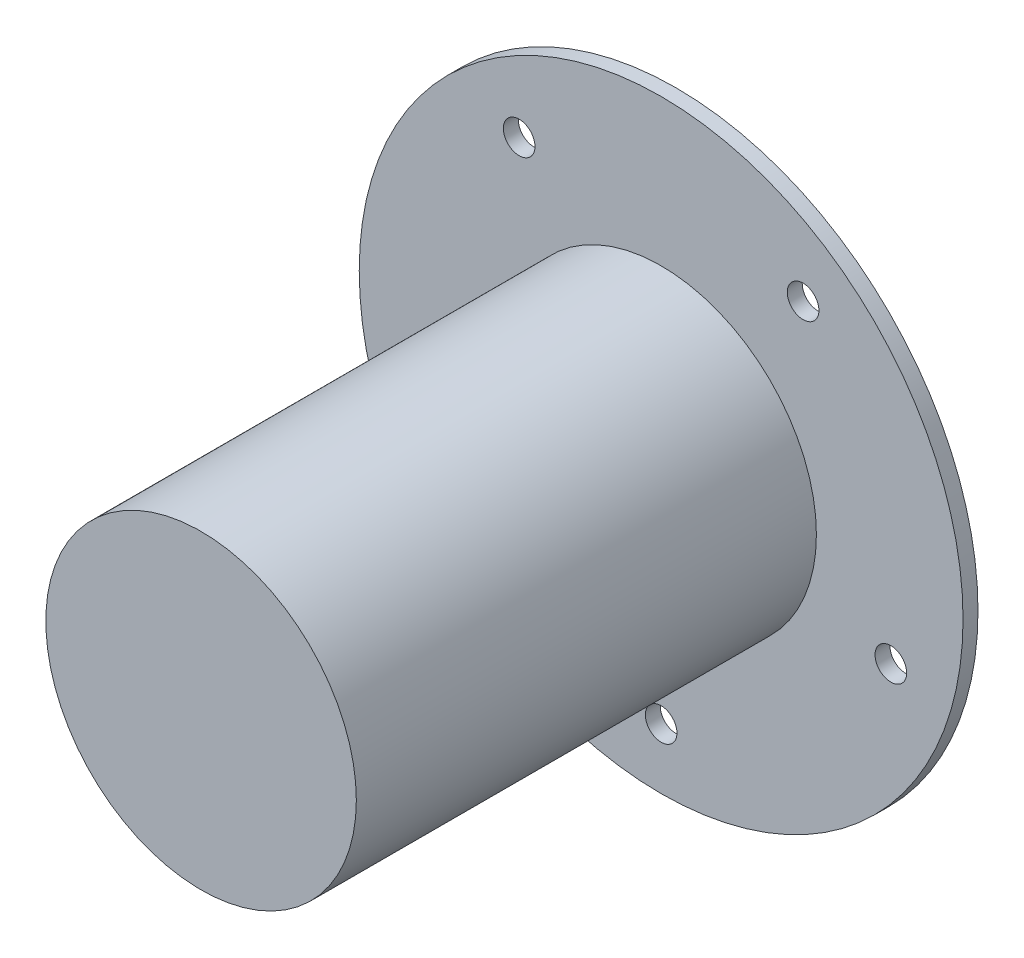
ISO-10303-21;
HEADER;
FILE_DESCRIPTION(('STEP AP214'),'2;1');
FILE_NAME('part.step','',(''),(''),'','','');
FILE_SCHEMA(('AUTOMOTIVE_DESIGN { 1 0 10303 214 1 1 1 1 }'));
ENDSEC;
DATA;
#1=APPLICATION_CONTEXT('core data for automotive mechanical design processes');
#2=APPLICATION_PROTOCOL_DEFINITION('international standard','automotive_design',2000,#1);
#3=PRODUCT_CONTEXT('',#1,'mechanical');
#4=PRODUCT('Part','Part','',(#3));
#5=PRODUCT_RELATED_PRODUCT_CATEGORY('part','',(#4));
#6=PRODUCT_DEFINITION_FORMATION('','',#4);
#7=PRODUCT_DEFINITION_CONTEXT('part definition',#1,'design');
#8=PRODUCT_DEFINITION('design','',#6,#7);
#9=PRODUCT_DEFINITION_SHAPE('','',#8);
#10=(LENGTH_UNIT() NAMED_UNIT(*) SI_UNIT(.MILLI.,.METRE.));
#11=(NAMED_UNIT(*) PLANE_ANGLE_UNIT() SI_UNIT($,.RADIAN.));
#12=(NAMED_UNIT(*) SI_UNIT($,.STERADIAN.) SOLID_ANGLE_UNIT());
#13=UNCERTAINTY_MEASURE_WITH_UNIT(LENGTH_MEASURE(1.E-05),#10,'distance_accuracy_value','');
#14=(GEOMETRIC_REPRESENTATION_CONTEXT(3) GLOBAL_UNCERTAINTY_ASSIGNED_CONTEXT((#13)) GLOBAL_UNIT_ASSIGNED_CONTEXT((#10,
#11,#12)) REPRESENTATION_CONTEXT('',''));
#15=CARTESIAN_POINT('',(0.,0.,0.));
#16=DIRECTION('',(0.,0.,1.));
#17=DIRECTION('',(1.,0.,0.));
#18=AXIS2_PLACEMENT_3D('',#15,#16,#17);
#19=CARTESIAN_POINT('',(0.,0.,-2.59999999999999));
#20=DIRECTION('',(0.,0.,1.));
#21=DIRECTION('',(1.,0.,0.));
#22=AXIS2_PLACEMENT_3D('',#19,#20,#21);
#23=CYLINDRICAL_SURFACE('',#22,52.5);
#24=CARTESIAN_POINT('',(0.,0.,-2.59999999999999));
#25=DIRECTION('',(0.,0.,1.));
#26=DIRECTION('',(-1.,0.,0.));
#27=AXIS2_PLACEMENT_3D('',#24,#25,#26);
#28=CIRCLE('',#27,52.5);
#29=CARTESIAN_POINT('',(52.5,0.,-2.59999999999999));
#30=VERTEX_POINT('',#29);
#31=EDGE_CURVE('E37',#30,#30,#28,.T.);
#32=CARTESIAN_POINT('',(0.,0.,0.));
#33=DIRECTION('',(0.,0.,1.));
#34=DIRECTION('',(-1.,0.,0.));
#35=AXIS2_PLACEMENT_3D('',#32,#33,#34);
#36=CIRCLE('',#35,52.5);
#37=CARTESIAN_POINT('',(52.5,0.,0.));
#38=VERTEX_POINT('',#37);
#39=EDGE_CURVE('E33',#38,#38,#36,.T.);
#40=CARTESIAN_POINT('',(52.5,0.,-2.59999999999999));
#41=CARTESIAN_POINT('',(52.5,0.,-2.57291666666666));
#42=CARTESIAN_POINT('',(52.5,0.,-2.54583333333332));
#43=CARTESIAN_POINT('',(52.5,0.,-2.49166666666666));
#44=CARTESIAN_POINT('',(52.5,0.,-2.46458333333333));
#45=CARTESIAN_POINT('',(52.5,0.,-2.41041666666666));
#46=CARTESIAN_POINT('',(52.5,0.,-2.38333333333333));
#47=CARTESIAN_POINT('',(52.5,0.,-2.32916666666666));
#48=CARTESIAN_POINT('',(52.5,0.,-2.30208333333333));
#49=CARTESIAN_POINT('',(52.5,0.,-2.24791666666666));
#50=CARTESIAN_POINT('',(52.5,0.,-2.22083333333333));
#51=CARTESIAN_POINT('',(52.5,0.,-2.16666666666666));
#52=CARTESIAN_POINT('',(52.5,0.,-2.13958333333333));
#53=CARTESIAN_POINT('',(52.5,0.,-2.08541666666666));
#54=CARTESIAN_POINT('',(52.5,0.,-2.05833333333333));
#55=CARTESIAN_POINT('',(52.5,0.,-2.00416666666666));
#56=CARTESIAN_POINT('',(52.5,0.,-1.97708333333333));
#57=CARTESIAN_POINT('',(52.5,0.,-1.92291666666666));
#58=CARTESIAN_POINT('',(52.5,0.,-1.89583333333333));
#59=CARTESIAN_POINT('',(52.5,0.,-1.84166666666666));
#60=CARTESIAN_POINT('',(52.5,0.,-1.81458333333333));
#61=CARTESIAN_POINT('',(52.5,0.,-1.76041666666666));
#62=CARTESIAN_POINT('',(52.5,0.,-1.73333333333333));
#63=CARTESIAN_POINT('',(52.5,0.,-1.67916666666666));
#64=CARTESIAN_POINT('',(52.5,0.,-1.65208333333333));
#65=CARTESIAN_POINT('',(52.5,0.,-1.59791666666666));
#66=CARTESIAN_POINT('',(52.5,0.,-1.57083333333333));
#67=CARTESIAN_POINT('',(52.5,0.,-1.51666666666666));
#68=CARTESIAN_POINT('',(52.5,0.,-1.48958333333333));
#69=CARTESIAN_POINT('',(52.5,0.,-1.43541666666666));
#70=CARTESIAN_POINT('',(52.5,0.,-1.40833333333333));
#71=CARTESIAN_POINT('',(52.5,0.,-1.35416666666666));
#72=CARTESIAN_POINT('',(52.5,0.,-1.32708333333333));
#73=CARTESIAN_POINT('',(52.5,0.,-1.27291666666666));
#74=CARTESIAN_POINT('',(52.5,0.,-1.24583333333333));
#75=CARTESIAN_POINT('',(52.5,0.,-1.19166666666666));
#76=CARTESIAN_POINT('',(52.5,0.,-1.16458333333333));
#77=CARTESIAN_POINT('',(52.5,0.,-1.11041666666666));
#78=CARTESIAN_POINT('',(52.5,0.,-1.08333333333333));
#79=CARTESIAN_POINT('',(52.5,0.,-1.02916666666666));
#80=CARTESIAN_POINT('',(52.5,0.,-1.00208333333333));
#81=CARTESIAN_POINT('',(52.5,0.,-0.947916666666664));
#82=CARTESIAN_POINT('',(52.5,0.,-0.920833333333331));
#83=CARTESIAN_POINT('',(52.5,0.,-0.866666666666664));
#84=CARTESIAN_POINT('',(52.5,0.,-0.839583333333331));
#85=CARTESIAN_POINT('',(52.5,0.,-0.785416666666664));
#86=CARTESIAN_POINT('',(52.5,0.,-0.758333333333331));
#87=CARTESIAN_POINT('',(52.5,0.,-0.704166666666664));
#88=CARTESIAN_POINT('',(52.5,0.,-0.677083333333331));
#89=CARTESIAN_POINT('',(52.5,0.,-0.622916666666665));
#90=CARTESIAN_POINT('',(52.5,0.,-0.595833333333332));
#91=CARTESIAN_POINT('',(52.5,0.,-0.541666666666665));
#92=CARTESIAN_POINT('',(52.5,0.,-0.514583333333332));
#93=CARTESIAN_POINT('',(52.5,0.,-0.460416666666666));
#94=CARTESIAN_POINT('',(52.5,0.,-0.433333333333332));
#95=CARTESIAN_POINT('',(52.5,0.,-0.379166666666666));
#96=CARTESIAN_POINT('',(52.5,0.,-0.352083333333333));
#97=CARTESIAN_POINT('',(52.5,0.,-0.297916666666666));
#98=CARTESIAN_POINT('',(52.5,0.,-0.270833333333333));
#99=CARTESIAN_POINT('',(52.5,0.,-0.216666666666666));
#100=CARTESIAN_POINT('',(52.5,0.,-0.189583333333333));
#101=CARTESIAN_POINT('',(52.5,0.,-0.135416666666667));
#102=CARTESIAN_POINT('',(52.5,0.,-0.108333333333333));
#103=CARTESIAN_POINT('',(52.5,0.,-0.0541666666666669));
#104=CARTESIAN_POINT('',(52.5,0.,-0.0270833333333337));
#105=CARTESIAN_POINT('',(52.5,0.,0.));
#106=B_SPLINE_CURVE_WITH_KNOTS('',3,(#40,#41,#42,#43,#44,#45,#46,#47,#48,#49,#50,#51,#52,#53,
#54,#55,#56,#57,#58,#59,#60,#61,#62,#63,#64,#65,#66,#67,#68,#69,#70,#71,#72,#73,#74,#75,#76,#77,
#78,#79,#80,#81,#82,#83,#84,#85,#86,#87,#88,#89,#90,#91,#92,#93,#94,#95,#96,#97,#98,#99,#100,
#101,#102,#103,#104,#105),.UNSPECIFIED.,.F.,.F.,(4,2,2,2,2,2,2,2,2,2,2,2,2,2,2,2,2,2,2,2,2,2,2,
2,2,2,2,2,2,2,2,2,4),(0.,0.0812500000000002,0.1625,0.24375,0.324999999999999,0.406249999999999,
0.487499999999999,0.568749999999999,0.649999999999998,0.731249999999998,0.812499999999997,
0.893749999999997,0.974999999999997,1.05625,1.1375,1.21875,1.3,1.38125,1.4625,1.54375,
1.62499999999999,1.70624999999999,1.78749999999999,1.86874999999999,1.94999999999999,
2.03124999999999,2.11249999999999,2.19374999999999,2.27499999999999,2.35624999999999,
2.43749999999999,2.51874999999999,2.59999999999999),.UNSPECIFIED.);
#107=EDGE_CURVE('BSEAM30',#30,#38,#106,.T.);
#108=ORIENTED_EDGE('',*,*,#31,.T.);
#109=ORIENTED_EDGE('',*,*,#39,.F.);
#110=ORIENTED_EDGE('',*,*,#107,.T.);
#111=ORIENTED_EDGE('',*,*,#107,.F.);
#112=EDGE_LOOP('',(#108,#110,#109,#111));
#113=FACE_BOUND('',#112,.T.);
#114=ADVANCED_FACE('F30',(#113),#23,.T.);
#115=CARTESIAN_POINT('',(0.,0.,-2.59999999999999));
#116=DIRECTION('',(0.,0.,-1.));
#117=DIRECTION('',(-1.,0.,0.));
#118=AXIS2_PLACEMENT_3D('',#115,#116,#117);
#119=PLANE('',#118);
#120=CARTESIAN_POINT('',(-24.6869805962838,33.9787137637479,-2.59999999999999));
#121=DIRECTION('',(0.,0.,1.));
#122=DIRECTION('',(-0.309016994374945,0.951056516295155,0.));
#123=AXIS2_PLACEMENT_3D('',#120,#121,#122);
#124=CIRCLE('',#123,2.75);
#125=CARTESIAN_POINT('',(-23.8371838617527,31.3633083439362,-2.59999999999999));
#126=VERTEX_POINT('',#125);
#127=EDGE_CURVE('E69',#126,#126,#124,.T.);
#128=ORIENTED_EDGE('',*,*,#127,.T.);
#129=EDGE_LOOP('',(#128));
#130=FACE_BOUND('',#129,.T.);
#131=CARTESIAN_POINT('',(24.6869805962841,33.9787137637477,-2.59999999999999));
#132=DIRECTION('',(0.,0.,1.));
#133=DIRECTION('',(0.809016994374951,0.587785252292469,0.));
#134=AXIS2_PLACEMENT_3D('',#131,#132,#133);
#135=CIRCLE('',#134,2.75);
#136=CARTESIAN_POINT('',(22.4621838617529,32.3623043199434,-2.59999999999999));
#137=VERTEX_POINT('',#136);
#138=EDGE_CURVE('E63',#137,#137,#135,.T.);
#139=ORIENTED_EDGE('',*,*,#138,.T.);
#140=EDGE_LOOP('',(#139));
#141=FACE_BOUND('',#140,.T.);
#142=CARTESIAN_POINT('',(39.9443736843963,-12.9787137637481,-2.59999999999999));
#143=DIRECTION('',(0.,0.,1.));
#144=DIRECTION('',(0.809016994374942,-0.58778525229248,0.));
#145=AXIS2_PLACEMENT_3D('',#142,#143,#144);
#146=CIRCLE('',#145,2.75);
#147=CARTESIAN_POINT('',(37.7195769498652,-11.3623043199438,-2.59999999999999));
#148=VERTEX_POINT('',#147);
#149=EDGE_CURVE('E56',#148,#148,#146,.T.);
#150=ORIENTED_EDGE('',*,*,#149,.T.);
#151=EDGE_LOOP('',(#150));
#152=FACE_BOUND('',#151,.T.);
#153=CARTESIAN_POINT('',(-4.66640615037761E-13,-42.,-2.59999999999999));
#154=DIRECTION('',(0.,0.,1.));
#155=DIRECTION('',(-0.309016994374958,-0.95105651629515,0.));
#156=AXIS2_PLACEMENT_3D('',#153,#154,#155);
#157=CIRCLE('',#156,2.75);
#158=CARTESIAN_POINT('',(0.849796734530669,-39.3845945801883,-2.59999999999999));
#159=VERTEX_POINT('',#158);
#160=EDGE_CURVE('E57',#159,#159,#157,.T.);
#161=ORIENTED_EDGE('',*,*,#160,.T.);
#162=EDGE_LOOP('',(#161));
#163=FACE_BOUND('',#162,.T.);
#164=CARTESIAN_POINT('',(-39.9443736843964,-12.9787137637478,-2.59999999999999));
#165=DIRECTION('',(0.,0.,1.));
#166=DIRECTION('',(-1.,0.,0.));
#167=AXIS2_PLACEMENT_3D('',#164,#165,#166);
#168=CIRCLE('',#167,2.75);
#169=CARTESIAN_POINT('',(-37.1943736843964,-12.9787137637478,-2.59999999999999));
#170=VERTEX_POINT('',#169);
#171=EDGE_CURVE('E46',#170,#170,#168,.T.);
#172=ORIENTED_EDGE('',*,*,#171,.T.);
#173=EDGE_LOOP('',(#172));
#174=FACE_BOUND('',#173,.T.);
#175=ORIENTED_EDGE('',*,*,#31,.F.);
#176=EDGE_LOOP('',(#175));
#177=FACE_BOUND('',#176,.T.);
#178=ADVANCED_FACE('F77',(#130,#141,#152,#163,#174,#177),#119,.T.);
#179=CARTESIAN_POINT('',(0.,0.,0.));
#180=DIRECTION('',(0.,0.,-1.));
#181=DIRECTION('',(-1.,0.,0.));
#182=AXIS2_PLACEMENT_3D('',#179,#180,#181);
#183=PLANE('',#182);
#184=CARTESIAN_POINT('',(-24.6869805962838,33.9787137637479,0.));
#185=DIRECTION('',(0.,0.,1.));
#186=DIRECTION('',(-0.309016994374945,0.951056516295155,0.));
#187=AXIS2_PLACEMENT_3D('',#184,#185,#186);
#188=CIRCLE('',#187,2.75);
#189=CARTESIAN_POINT('',(-23.8371838617527,31.3633083439362,0.));
#190=VERTEX_POINT('',#189);
#191=EDGE_CURVE('E50',#190,#190,#188,.T.);
#192=ORIENTED_EDGE('',*,*,#191,.F.);
#193=EDGE_LOOP('',(#192));
#194=FACE_BOUND('',#193,.T.);
#195=CARTESIAN_POINT('',(24.6869805962841,33.9787137637477,0.));
#196=DIRECTION('',(0.,0.,1.));
#197=DIRECTION('',(0.809016994374951,0.587785252292469,0.));
#198=AXIS2_PLACEMENT_3D('',#195,#196,#197);
#199=CIRCLE('',#198,2.75);
#200=CARTESIAN_POINT('',(22.4621838617529,32.3623043199434,0.));
#201=VERTEX_POINT('',#200);
#202=EDGE_CURVE('E66',#201,#201,#199,.T.);
#203=ORIENTED_EDGE('',*,*,#202,.F.);
#204=EDGE_LOOP('',(#203));
#205=FACE_BOUND('',#204,.T.);
#206=CARTESIAN_POINT('',(39.9443736843963,-12.9787137637481,0.));
#207=DIRECTION('',(0.,0.,1.));
#208=DIRECTION('',(0.809016994374942,-0.58778525229248,0.));
#209=AXIS2_PLACEMENT_3D('',#206,#207,#208);
#210=CIRCLE('',#209,2.75);
#211=CARTESIAN_POINT('',(37.7195769498652,-11.3623043199438,0.));
#212=VERTEX_POINT('',#211);
#213=EDGE_CURVE('E60',#212,#212,#210,.T.);
#214=ORIENTED_EDGE('',*,*,#213,.F.);
#215=EDGE_LOOP('',(#214));
#216=FACE_BOUND('',#215,.T.);
#217=CARTESIAN_POINT('',(-4.66640615037761E-13,-42.,0.));
#218=DIRECTION('',(0.,0.,1.));
#219=DIRECTION('',(-0.309016994374958,-0.95105651629515,0.));
#220=AXIS2_PLACEMENT_3D('',#217,#218,#219);
#221=CIRCLE('',#220,2.75);
#222=CARTESIAN_POINT('',(0.849796734530669,-39.3845945801883,0.));
#223=VERTEX_POINT('',#222);
#224=EDGE_CURVE('E53',#223,#223,#221,.T.);
#225=ORIENTED_EDGE('',*,*,#224,.F.);
#226=EDGE_LOOP('',(#225));
#227=FACE_BOUND('',#226,.T.);
#228=CARTESIAN_POINT('',(-39.9443736843964,-12.9787137637478,0.));
#229=DIRECTION('',(0.,0.,1.));
#230=DIRECTION('',(-1.,0.,0.));
#231=AXIS2_PLACEMENT_3D('',#228,#229,#230);
#232=CIRCLE('',#231,2.75);
#233=CARTESIAN_POINT('',(-37.1943736843964,-12.9787137637478,0.));
#234=VERTEX_POINT('',#233);
#235=EDGE_CURVE('E47',#234,#234,#232,.T.);
#236=ORIENTED_EDGE('',*,*,#235,.F.);
#237=EDGE_LOOP('',(#236));
#238=FACE_BOUND('',#237,.T.);
#239=CARTESIAN_POINT('',(0.,0.,0.));
#240=DIRECTION('',(0.,0.,1.));
#241=DIRECTION('',(1.,0.,0.));
#242=AXIS2_PLACEMENT_3D('',#239,#240,#241);
#243=CIRCLE('',#242,27.);
#244=CARTESIAN_POINT('',(27.,0.,0.));
#245=VERTEX_POINT('',#244);
#246=EDGE_CURVE('E10',#245,#245,#243,.T.);
#247=ORIENTED_EDGE('',*,*,#246,.F.);
#248=EDGE_LOOP('',(#247));
#249=FACE_BOUND('',#248,.T.);
#250=ORIENTED_EDGE('',*,*,#39,.T.);
#251=EDGE_LOOP('',(#250));
#252=FACE_BOUND('',#251,.T.);
#253=ADVANCED_FACE('F87',(#194,#205,#216,#227,#238,#249,#252),#183,.F.);
#254=CARTESIAN_POINT('',(0.,0.,80.));
#255=DIRECTION('',(0.,0.,-1.));
#256=DIRECTION('',(-1.,0.,0.));
#257=AXIS2_PLACEMENT_3D('',#254,#255,#256);
#258=CYLINDRICAL_SURFACE('',#257,27.);
#259=CARTESIAN_POINT('',(0.,0.,80.));
#260=DIRECTION('',(0.,0.,1.));
#261=DIRECTION('',(1.,0.,0.));
#262=AXIS2_PLACEMENT_3D('',#259,#260,#261);
#263=CIRCLE('',#262,27.);
#264=CARTESIAN_POINT('',(27.,0.,80.));
#265=VERTEX_POINT('',#264);
#266=EDGE_CURVE('E43',#265,#265,#263,.T.);
#267=ORIENTED_EDGE('',*,*,#266,.F.);
#268=EDGE_LOOP('',(#267));
#269=FACE_BOUND('',#268,.T.);
#270=ORIENTED_EDGE('',*,*,#246,.T.);
#271=EDGE_LOOP('',(#270));
#272=FACE_BOUND('',#271,.T.);
#273=ADVANCED_FACE('F90',(#269,#272),#258,.T.);
#274=CARTESIAN_POINT('',(0.,0.,80.));
#275=DIRECTION('',(0.,0.,1.));
#276=DIRECTION('',(1.,0.,0.));
#277=AXIS2_PLACEMENT_3D('',#274,#275,#276);
#278=PLANE('',#277);
#279=ORIENTED_EDGE('',*,*,#266,.T.);
#280=EDGE_LOOP('',(#279));
#281=FACE_BOUND('',#280,.T.);
#282=ADVANCED_FACE('F116',(#281),#278,.T.);
#283=CARTESIAN_POINT('',(-39.9443736843964,-12.9787137637478,-2.59999999999999));
#284=DIRECTION('',(0.,0.,1.));
#285=DIRECTION('',(1.,0.,0.));
#286=AXIS2_PLACEMENT_3D('',#283,#284,#285);
#287=CYLINDRICAL_SURFACE('',#286,2.75);
#288=CARTESIAN_POINT('',(-37.1943736843964,-12.9787137637478,-2.59999999999999));
#289=CARTESIAN_POINT('',(-37.1943736843964,-12.9787137637478,-2.57291666666666));
#290=CARTESIAN_POINT('',(-37.1943736843964,-12.9787137637478,-2.54583333333332));
#291=CARTESIAN_POINT('',(-37.1943736843964,-12.9787137637478,-2.49166666666666));
#292=CARTESIAN_POINT('',(-37.1943736843964,-12.9787137637478,-2.46458333333333));
#293=CARTESIAN_POINT('',(-37.1943736843964,-12.9787137637478,-2.41041666666666));
#294=CARTESIAN_POINT('',(-37.1943736843964,-12.9787137637478,-2.38333333333333));
#295=CARTESIAN_POINT('',(-37.1943736843964,-12.9787137637478,-2.32916666666666));
#296=CARTESIAN_POINT('',(-37.1943736843964,-12.9787137637478,-2.30208333333333));
#297=CARTESIAN_POINT('',(-37.1943736843964,-12.9787137637478,-2.24791666666666));
#298=CARTESIAN_POINT('',(-37.1943736843964,-12.9787137637478,-2.22083333333333));
#299=CARTESIAN_POINT('',(-37.1943736843964,-12.9787137637478,-2.16666666666666));
#300=CARTESIAN_POINT('',(-37.1943736843964,-12.9787137637478,-2.13958333333333));
#301=CARTESIAN_POINT('',(-37.1943736843964,-12.9787137637478,-2.08541666666666));
#302=CARTESIAN_POINT('',(-37.1943736843964,-12.9787137637478,-2.05833333333333));
#303=CARTESIAN_POINT('',(-37.1943736843964,-12.9787137637478,-2.00416666666666));
#304=CARTESIAN_POINT('',(-37.1943736843964,-12.9787137637478,-1.97708333333333));
#305=CARTESIAN_POINT('',(-37.1943736843964,-12.9787137637478,-1.92291666666666));
#306=CARTESIAN_POINT('',(-37.1943736843964,-12.9787137637478,-1.89583333333333));
#307=CARTESIAN_POINT('',(-37.1943736843964,-12.9787137637478,-1.84166666666666));
#308=CARTESIAN_POINT('',(-37.1943736843964,-12.9787137637478,-1.81458333333333));
#309=CARTESIAN_POINT('',(-37.1943736843964,-12.9787137637478,-1.76041666666666));
#310=CARTESIAN_POINT('',(-37.1943736843964,-12.9787137637478,-1.73333333333333));
#311=CARTESIAN_POINT('',(-37.1943736843964,-12.9787137637478,-1.67916666666666));
#312=CARTESIAN_POINT('',(-37.1943736843964,-12.9787137637478,-1.65208333333333));
#313=CARTESIAN_POINT('',(-37.1943736843964,-12.9787137637478,-1.59791666666666));
#314=CARTESIAN_POINT('',(-37.1943736843964,-12.9787137637478,-1.57083333333333));
#315=CARTESIAN_POINT('',(-37.1943736843964,-12.9787137637478,-1.51666666666666));
#316=CARTESIAN_POINT('',(-37.1943736843964,-12.9787137637478,-1.48958333333333));
#317=CARTESIAN_POINT('',(-37.1943736843964,-12.9787137637478,-1.43541666666666));
#318=CARTESIAN_POINT('',(-37.1943736843964,-12.9787137637478,-1.40833333333333));
#319=CARTESIAN_POINT('',(-37.1943736843964,-12.9787137637478,-1.35416666666666));
#320=CARTESIAN_POINT('',(-37.1943736843964,-12.9787137637478,-1.32708333333333));
#321=CARTESIAN_POINT('',(-37.1943736843964,-12.9787137637478,-1.27291666666666));
#322=CARTESIAN_POINT('',(-37.1943736843964,-12.9787137637478,-1.24583333333333));
#323=CARTESIAN_POINT('',(-37.1943736843964,-12.9787137637478,-1.19166666666666));
#324=CARTESIAN_POINT('',(-37.1943736843964,-12.9787137637478,-1.16458333333333));
#325=CARTESIAN_POINT('',(-37.1943736843964,-12.9787137637478,-1.11041666666666));
#326=CARTESIAN_POINT('',(-37.1943736843964,-12.9787137637478,-1.08333333333333));
#327=CARTESIAN_POINT('',(-37.1943736843964,-12.9787137637478,-1.02916666666666));
#328=CARTESIAN_POINT('',(-37.1943736843964,-12.9787137637478,-1.00208333333333));
#329=CARTESIAN_POINT('',(-37.1943736843964,-12.9787137637478,-0.947916666666664));
#330=CARTESIAN_POINT('',(-37.1943736843964,-12.9787137637478,-0.920833333333331));
#331=CARTESIAN_POINT('',(-37.1943736843964,-12.9787137637478,-0.866666666666664));
#332=CARTESIAN_POINT('',(-37.1943736843964,-12.9787137637478,-0.839583333333331));
#333=CARTESIAN_POINT('',(-37.1943736843964,-12.9787137637478,-0.785416666666664));
#334=CARTESIAN_POINT('',(-37.1943736843964,-12.9787137637478,-0.758333333333331));
#335=CARTESIAN_POINT('',(-37.1943736843964,-12.9787137637478,-0.704166666666664));
#336=CARTESIAN_POINT('',(-37.1943736843964,-12.9787137637478,-0.677083333333331));
#337=CARTESIAN_POINT('',(-37.1943736843964,-12.9787137637478,-0.622916666666665));
#338=CARTESIAN_POINT('',(-37.1943736843964,-12.9787137637478,-0.595833333333332));
#339=CARTESIAN_POINT('',(-37.1943736843964,-12.9787137637478,-0.541666666666665));
#340=CARTESIAN_POINT('',(-37.1943736843964,-12.9787137637478,-0.514583333333332));
#341=CARTESIAN_POINT('',(-37.1943736843964,-12.9787137637478,-0.460416666666666));
#342=CARTESIAN_POINT('',(-37.1943736843964,-12.9787137637478,-0.433333333333332));
#343=CARTESIAN_POINT('',(-37.1943736843964,-12.9787137637478,-0.379166666666666));
#344=CARTESIAN_POINT('',(-37.1943736843964,-12.9787137637478,-0.352083333333333));
#345=CARTESIAN_POINT('',(-37.1943736843964,-12.9787137637478,-0.297916666666666));
#346=CARTESIAN_POINT('',(-37.1943736843964,-12.9787137637478,-0.270833333333333));
#347=CARTESIAN_POINT('',(-37.1943736843964,-12.9787137637478,-0.216666666666666));
#348=CARTESIAN_POINT('',(-37.1943736843964,-12.9787137637478,-0.189583333333333));
#349=CARTESIAN_POINT('',(-37.1943736843964,-12.9787137637478,-0.135416666666667));
#350=CARTESIAN_POINT('',(-37.1943736843964,-12.9787137637478,-0.108333333333333));
#351=CARTESIAN_POINT('',(-37.1943736843964,-12.9787137637478,-0.0541666666666669));
#352=CARTESIAN_POINT('',(-37.1943736843964,-12.9787137637478,-0.0270833333333337));
#353=CARTESIAN_POINT('',(-37.1943736843964,-12.9787137637478,0.));
#354=B_SPLINE_CURVE_WITH_KNOTS('',3,(#288,#289,#290,#291,#292,#293,#294,#295,#296,#297,#298,
#299,#300,#301,#302,#303,#304,#305,#306,#307,#308,#309,#310,#311,#312,#313,#314,#315,#316,#317,
#318,#319,#320,#321,#322,#323,#324,#325,#326,#327,#328,#329,#330,#331,#332,#333,#334,#335,#336,
#337,#338,#339,#340,#341,#342,#343,#344,#345,#346,#347,#348,#349,#350,#351,#352,#353),
.UNSPECIFIED.,.F.,.F.,(4,2,2,2,2,2,2,2,2,2,2,2,2,2,2,2,2,2,2,2,2,2,2,2,2,2,2,2,2,2,2,2,4),(0.,
0.0812500000000002,0.1625,0.24375,0.324999999999999,0.406249999999999,0.487499999999999,
0.568749999999999,0.649999999999998,0.731249999999998,0.812499999999997,0.893749999999997,
0.974999999999997,1.05625,1.1375,1.21875,1.3,1.38125,1.4625,1.54375,1.62499999999999,
1.70624999999999,1.78749999999999,1.86874999999999,1.94999999999999,2.03124999999999,
2.11249999999999,2.19374999999999,2.27499999999999,2.35624999999999,2.43749999999999,
2.51874999999999,2.59999999999999),.UNSPECIFIED.);
#355=EDGE_CURVE('BSEAM120',#170,#234,#354,.T.);
#356=ORIENTED_EDGE('',*,*,#171,.F.);
#357=ORIENTED_EDGE('',*,*,#235,.T.);
#358=ORIENTED_EDGE('',*,*,#355,.T.);
#359=ORIENTED_EDGE('',*,*,#355,.F.);
#360=EDGE_LOOP('',(#356,#358,#357,#359));
#361=FACE_BOUND('',#360,.T.);
#362=ADVANCED_FACE('F120',(#361),#287,.F.);
#363=CARTESIAN_POINT('',(-4.66640615037761E-13,-42.,-2.59999999999999));
#364=DIRECTION('',(0.,0.,1.));
#365=DIRECTION('',(0.309016994374958,0.95105651629515,0.));
#366=AXIS2_PLACEMENT_3D('',#363,#364,#365);
#367=CYLINDRICAL_SURFACE('',#366,2.75);
#368=CARTESIAN_POINT('',(0.849796734530669,-39.3845945801883,-2.59999999999999));
#369=CARTESIAN_POINT('',(0.849796734530669,-39.3845945801883,-2.57291666666666));
#370=CARTESIAN_POINT('',(0.849796734530669,-39.3845945801883,-2.54583333333332));
#371=CARTESIAN_POINT('',(0.849796734530669,-39.3845945801883,-2.49166666666666));
#372=CARTESIAN_POINT('',(0.849796734530669,-39.3845945801883,-2.46458333333333));
#373=CARTESIAN_POINT('',(0.849796734530669,-39.3845945801883,-2.41041666666666));
#374=CARTESIAN_POINT('',(0.849796734530669,-39.3845945801883,-2.38333333333333));
#375=CARTESIAN_POINT('',(0.849796734530669,-39.3845945801883,-2.32916666666666));
#376=CARTESIAN_POINT('',(0.849796734530669,-39.3845945801883,-2.30208333333333));
#377=CARTESIAN_POINT('',(0.849796734530669,-39.3845945801883,-2.24791666666666));
#378=CARTESIAN_POINT('',(0.849796734530669,-39.3845945801883,-2.22083333333333));
#379=CARTESIAN_POINT('',(0.849796734530669,-39.3845945801883,-2.16666666666666));
#380=CARTESIAN_POINT('',(0.849796734530669,-39.3845945801883,-2.13958333333333));
#381=CARTESIAN_POINT('',(0.849796734530669,-39.3845945801883,-2.08541666666666));
#382=CARTESIAN_POINT('',(0.849796734530669,-39.3845945801883,-2.05833333333333));
#383=CARTESIAN_POINT('',(0.849796734530669,-39.3845945801883,-2.00416666666666));
#384=CARTESIAN_POINT('',(0.849796734530669,-39.3845945801883,-1.97708333333333));
#385=CARTESIAN_POINT('',(0.849796734530669,-39.3845945801883,-1.92291666666666));
#386=CARTESIAN_POINT('',(0.849796734530669,-39.3845945801883,-1.89583333333333));
#387=CARTESIAN_POINT('',(0.849796734530669,-39.3845945801883,-1.84166666666666));
#388=CARTESIAN_POINT('',(0.849796734530669,-39.3845945801883,-1.81458333333333));
#389=CARTESIAN_POINT('',(0.849796734530669,-39.3845945801883,-1.76041666666666));
#390=CARTESIAN_POINT('',(0.849796734530669,-39.3845945801883,-1.73333333333333));
#391=CARTESIAN_POINT('',(0.849796734530669,-39.3845945801883,-1.67916666666666));
#392=CARTESIAN_POINT('',(0.849796734530669,-39.3845945801883,-1.65208333333333));
#393=CARTESIAN_POINT('',(0.849796734530669,-39.3845945801883,-1.59791666666666));
#394=CARTESIAN_POINT('',(0.849796734530669,-39.3845945801883,-1.57083333333333));
#395=CARTESIAN_POINT('',(0.849796734530669,-39.3845945801883,-1.51666666666666));
#396=CARTESIAN_POINT('',(0.849796734530669,-39.3845945801883,-1.48958333333333));
#397=CARTESIAN_POINT('',(0.849796734530669,-39.3845945801883,-1.43541666666666));
#398=CARTESIAN_POINT('',(0.849796734530669,-39.3845945801883,-1.40833333333333));
#399=CARTESIAN_POINT('',(0.849796734530669,-39.3845945801883,-1.35416666666666));
#400=CARTESIAN_POINT('',(0.849796734530669,-39.3845945801883,-1.32708333333333));
#401=CARTESIAN_POINT('',(0.849796734530669,-39.3845945801883,-1.27291666666666));
#402=CARTESIAN_POINT('',(0.849796734530669,-39.3845945801883,-1.24583333333333));
#403=CARTESIAN_POINT('',(0.849796734530669,-39.3845945801883,-1.19166666666666));
#404=CARTESIAN_POINT('',(0.849796734530669,-39.3845945801883,-1.16458333333333));
#405=CARTESIAN_POINT('',(0.849796734530669,-39.3845945801883,-1.11041666666666));
#406=CARTESIAN_POINT('',(0.849796734530669,-39.3845945801883,-1.08333333333333));
#407=CARTESIAN_POINT('',(0.849796734530669,-39.3845945801883,-1.02916666666666));
#408=CARTESIAN_POINT('',(0.849796734530669,-39.3845945801883,-1.00208333333333));
#409=CARTESIAN_POINT('',(0.849796734530669,-39.3845945801883,-0.947916666666664));
#410=CARTESIAN_POINT('',(0.849796734530669,-39.3845945801883,-0.920833333333331));
#411=CARTESIAN_POINT('',(0.849796734530669,-39.3845945801883,-0.866666666666664));
#412=CARTESIAN_POINT('',(0.849796734530669,-39.3845945801883,-0.839583333333331));
#413=CARTESIAN_POINT('',(0.849796734530669,-39.3845945801883,-0.785416666666664));
#414=CARTESIAN_POINT('',(0.849796734530669,-39.3845945801883,-0.758333333333331));
#415=CARTESIAN_POINT('',(0.849796734530669,-39.3845945801883,-0.704166666666664));
#416=CARTESIAN_POINT('',(0.849796734530669,-39.3845945801883,-0.677083333333331));
#417=CARTESIAN_POINT('',(0.849796734530669,-39.3845945801883,-0.622916666666665));
#418=CARTESIAN_POINT('',(0.849796734530669,-39.3845945801883,-0.595833333333332));
#419=CARTESIAN_POINT('',(0.849796734530669,-39.3845945801883,-0.541666666666665));
#420=CARTESIAN_POINT('',(0.849796734530669,-39.3845945801883,-0.514583333333332));
#421=CARTESIAN_POINT('',(0.849796734530669,-39.3845945801883,-0.460416666666666));
#422=CARTESIAN_POINT('',(0.849796734530669,-39.3845945801883,-0.433333333333332));
#423=CARTESIAN_POINT('',(0.849796734530669,-39.3845945801883,-0.379166666666666));
#424=CARTESIAN_POINT('',(0.849796734530669,-39.3845945801883,-0.352083333333333));
#425=CARTESIAN_POINT('',(0.849796734530669,-39.3845945801883,-0.297916666666666));
#426=CARTESIAN_POINT('',(0.849796734530669,-39.3845945801883,-0.270833333333333));
#427=CARTESIAN_POINT('',(0.849796734530669,-39.3845945801883,-0.216666666666666));
#428=CARTESIAN_POINT('',(0.849796734530669,-39.3845945801883,-0.189583333333333));
#429=CARTESIAN_POINT('',(0.849796734530669,-39.3845945801883,-0.135416666666667));
#430=CARTESIAN_POINT('',(0.849796734530669,-39.3845945801883,-0.108333333333333));
#431=CARTESIAN_POINT('',(0.849796734530669,-39.3845945801883,-0.0541666666666669));
#432=CARTESIAN_POINT('',(0.849796734530669,-39.3845945801883,-0.0270833333333337));
#433=CARTESIAN_POINT('',(0.849796734530669,-39.3845945801883,0.));
#434=B_SPLINE_CURVE_WITH_KNOTS('',3,(#368,#369,#370,#371,#372,#373,#374,#375,#376,#377,#378,
#379,#380,#381,#382,#383,#384,#385,#386,#387,#388,#389,#390,#391,#392,#393,#394,#395,#396,#397,
#398,#399,#400,#401,#402,#403,#404,#405,#406,#407,#408,#409,#410,#411,#412,#413,#414,#415,#416,
#417,#418,#419,#420,#421,#422,#423,#424,#425,#426,#427,#428,#429,#430,#431,#432,#433),
.UNSPECIFIED.,.F.,.F.,(4,2,2,2,2,2,2,2,2,2,2,2,2,2,2,2,2,2,2,2,2,2,2,2,2,2,2,2,2,2,2,2,4),(0.,
0.0812500000000002,0.1625,0.24375,0.324999999999999,0.406249999999999,0.487499999999999,
0.568749999999999,0.649999999999998,0.731249999999998,0.812499999999997,0.893749999999997,
0.974999999999997,1.05625,1.1375,1.21875,1.3,1.38125,1.4625,1.54375,1.62499999999999,
1.70624999999999,1.78749999999999,1.86874999999999,1.94999999999999,2.03124999999999,
2.11249999999999,2.19374999999999,2.27499999999999,2.35624999999999,2.43749999999999,
2.51874999999999,2.59999999999999),.UNSPECIFIED.);
#435=EDGE_CURVE('BSEAM124',#159,#223,#434,.T.);
#436=ORIENTED_EDGE('',*,*,#160,.F.);
#437=ORIENTED_EDGE('',*,*,#224,.T.);
#438=ORIENTED_EDGE('',*,*,#435,.T.);
#439=ORIENTED_EDGE('',*,*,#435,.F.);
#440=EDGE_LOOP('',(#436,#438,#437,#439));
#441=FACE_BOUND('',#440,.T.);
#442=ADVANCED_FACE('F124',(#441),#367,.F.);
#443=CARTESIAN_POINT('',(39.9443736843963,-12.9787137637481,-2.59999999999999));
#444=DIRECTION('',(0.,0.,1.));
#445=DIRECTION('',(-0.809016994374942,0.58778525229248,0.));
#446=AXIS2_PLACEMENT_3D('',#443,#444,#445);
#447=CYLINDRICAL_SURFACE('',#446,2.75);
#448=CARTESIAN_POINT('',(37.7195769498652,-11.3623043199438,-2.59999999999999));
#449=CARTESIAN_POINT('',(37.7195769498652,-11.3623043199438,-2.57291666666666));
#450=CARTESIAN_POINT('',(37.7195769498652,-11.3623043199438,-2.54583333333332));
#451=CARTESIAN_POINT('',(37.7195769498652,-11.3623043199438,-2.49166666666666));
#452=CARTESIAN_POINT('',(37.7195769498652,-11.3623043199438,-2.46458333333333));
#453=CARTESIAN_POINT('',(37.7195769498652,-11.3623043199438,-2.41041666666666));
#454=CARTESIAN_POINT('',(37.7195769498652,-11.3623043199438,-2.38333333333333));
#455=CARTESIAN_POINT('',(37.7195769498652,-11.3623043199438,-2.32916666666666));
#456=CARTESIAN_POINT('',(37.7195769498652,-11.3623043199438,-2.30208333333333));
#457=CARTESIAN_POINT('',(37.7195769498652,-11.3623043199438,-2.24791666666666));
#458=CARTESIAN_POINT('',(37.7195769498652,-11.3623043199438,-2.22083333333333));
#459=CARTESIAN_POINT('',(37.7195769498652,-11.3623043199438,-2.16666666666666));
#460=CARTESIAN_POINT('',(37.7195769498652,-11.3623043199438,-2.13958333333333));
#461=CARTESIAN_POINT('',(37.7195769498652,-11.3623043199438,-2.08541666666666));
#462=CARTESIAN_POINT('',(37.7195769498652,-11.3623043199438,-2.05833333333333));
#463=CARTESIAN_POINT('',(37.7195769498652,-11.3623043199438,-2.00416666666666));
#464=CARTESIAN_POINT('',(37.7195769498652,-11.3623043199438,-1.97708333333333));
#465=CARTESIAN_POINT('',(37.7195769498652,-11.3623043199438,-1.92291666666666));
#466=CARTESIAN_POINT('',(37.7195769498652,-11.3623043199438,-1.89583333333333));
#467=CARTESIAN_POINT('',(37.7195769498652,-11.3623043199438,-1.84166666666666));
#468=CARTESIAN_POINT('',(37.7195769498652,-11.3623043199438,-1.81458333333333));
#469=CARTESIAN_POINT('',(37.7195769498652,-11.3623043199438,-1.76041666666666));
#470=CARTESIAN_POINT('',(37.7195769498652,-11.3623043199438,-1.73333333333333));
#471=CARTESIAN_POINT('',(37.7195769498652,-11.3623043199438,-1.67916666666666));
#472=CARTESIAN_POINT('',(37.7195769498652,-11.3623043199438,-1.65208333333333));
#473=CARTESIAN_POINT('',(37.7195769498652,-11.3623043199438,-1.59791666666666));
#474=CARTESIAN_POINT('',(37.7195769498652,-11.3623043199438,-1.57083333333333));
#475=CARTESIAN_POINT('',(37.7195769498652,-11.3623043199438,-1.51666666666666));
#476=CARTESIAN_POINT('',(37.7195769498652,-11.3623043199438,-1.48958333333333));
#477=CARTESIAN_POINT('',(37.7195769498652,-11.3623043199438,-1.43541666666666));
#478=CARTESIAN_POINT('',(37.7195769498652,-11.3623043199438,-1.40833333333333));
#479=CARTESIAN_POINT('',(37.7195769498652,-11.3623043199438,-1.35416666666666));
#480=CARTESIAN_POINT('',(37.7195769498652,-11.3623043199438,-1.32708333333333));
#481=CARTESIAN_POINT('',(37.7195769498652,-11.3623043199438,-1.27291666666666));
#482=CARTESIAN_POINT('',(37.7195769498652,-11.3623043199438,-1.24583333333333));
#483=CARTESIAN_POINT('',(37.7195769498652,-11.3623043199438,-1.19166666666666));
#484=CARTESIAN_POINT('',(37.7195769498652,-11.3623043199438,-1.16458333333333));
#485=CARTESIAN_POINT('',(37.7195769498652,-11.3623043199438,-1.11041666666666));
#486=CARTESIAN_POINT('',(37.7195769498652,-11.3623043199438,-1.08333333333333));
#487=CARTESIAN_POINT('',(37.7195769498652,-11.3623043199438,-1.02916666666666));
#488=CARTESIAN_POINT('',(37.7195769498652,-11.3623043199438,-1.00208333333333));
#489=CARTESIAN_POINT('',(37.7195769498652,-11.3623043199438,-0.947916666666664));
#490=CARTESIAN_POINT('',(37.7195769498652,-11.3623043199438,-0.920833333333331));
#491=CARTESIAN_POINT('',(37.7195769498652,-11.3623043199438,-0.866666666666664));
#492=CARTESIAN_POINT('',(37.7195769498652,-11.3623043199438,-0.839583333333331));
#493=CARTESIAN_POINT('',(37.7195769498652,-11.3623043199438,-0.785416666666664));
#494=CARTESIAN_POINT('',(37.7195769498652,-11.3623043199438,-0.758333333333331));
#495=CARTESIAN_POINT('',(37.7195769498652,-11.3623043199438,-0.704166666666664));
#496=CARTESIAN_POINT('',(37.7195769498652,-11.3623043199438,-0.677083333333331));
#497=CARTESIAN_POINT('',(37.7195769498652,-11.3623043199438,-0.622916666666665));
#498=CARTESIAN_POINT('',(37.7195769498652,-11.3623043199438,-0.595833333333332));
#499=CARTESIAN_POINT('',(37.7195769498652,-11.3623043199438,-0.541666666666665));
#500=CARTESIAN_POINT('',(37.7195769498652,-11.3623043199438,-0.514583333333332));
#501=CARTESIAN_POINT('',(37.7195769498652,-11.3623043199438,-0.460416666666666));
#502=CARTESIAN_POINT('',(37.7195769498652,-11.3623043199438,-0.433333333333332));
#503=CARTESIAN_POINT('',(37.7195769498652,-11.3623043199438,-0.379166666666666));
#504=CARTESIAN_POINT('',(37.7195769498652,-11.3623043199438,-0.352083333333333));
#505=CARTESIAN_POINT('',(37.7195769498652,-11.3623043199438,-0.297916666666666));
#506=CARTESIAN_POINT('',(37.7195769498652,-11.3623043199438,-0.270833333333333));
#507=CARTESIAN_POINT('',(37.7195769498652,-11.3623043199438,-0.216666666666666));
#508=CARTESIAN_POINT('',(37.7195769498652,-11.3623043199438,-0.189583333333333));
#509=CARTESIAN_POINT('',(37.7195769498652,-11.3623043199438,-0.135416666666667));
#510=CARTESIAN_POINT('',(37.7195769498652,-11.3623043199438,-0.108333333333333));
#511=CARTESIAN_POINT('',(37.7195769498652,-11.3623043199438,-0.0541666666666669));
#512=CARTESIAN_POINT('',(37.7195769498652,-11.3623043199438,-0.0270833333333337));
#513=CARTESIAN_POINT('',(37.7195769498652,-11.3623043199438,0.));
#514=B_SPLINE_CURVE_WITH_KNOTS('',3,(#448,#449,#450,#451,#452,#453,#454,#455,#456,#457,#458,
#459,#460,#461,#462,#463,#464,#465,#466,#467,#468,#469,#470,#471,#472,#473,#474,#475,#476,#477,
#478,#479,#480,#481,#482,#483,#484,#485,#486,#487,#488,#489,#490,#491,#492,#493,#494,#495,#496,
#497,#498,#499,#500,#501,#502,#503,#504,#505,#506,#507,#508,#509,#510,#511,#512,#513),
.UNSPECIFIED.,.F.,.F.,(4,2,2,2,2,2,2,2,2,2,2,2,2,2,2,2,2,2,2,2,2,2,2,2,2,2,2,2,2,2,2,2,4),(0.,
0.0812500000000002,0.1625,0.24375,0.324999999999999,0.406249999999999,0.487499999999999,
0.568749999999999,0.649999999999998,0.731249999999998,0.812499999999997,0.893749999999997,
0.974999999999997,1.05625,1.1375,1.21875,1.3,1.38125,1.4625,1.54375,1.62499999999999,
1.70624999999999,1.78749999999999,1.86874999999999,1.94999999999999,2.03124999999999,
2.11249999999999,2.19374999999999,2.27499999999999,2.35624999999999,2.43749999999999,
2.51874999999999,2.59999999999999),.UNSPECIFIED.);
#515=EDGE_CURVE('BSEAM128',#148,#212,#514,.T.);
#516=ORIENTED_EDGE('',*,*,#149,.F.);
#517=ORIENTED_EDGE('',*,*,#213,.T.);
#518=ORIENTED_EDGE('',*,*,#515,.T.);
#519=ORIENTED_EDGE('',*,*,#515,.F.);
#520=EDGE_LOOP('',(#516,#518,#517,#519));
#521=FACE_BOUND('',#520,.T.);
#522=ADVANCED_FACE('F128',(#521),#447,.F.);
#523=CARTESIAN_POINT('',(24.6869805962841,33.9787137637477,-2.59999999999999));
#524=DIRECTION('',(0.,0.,1.));
#525=DIRECTION('',(-0.809016994374951,-0.587785252292469,0.));
#526=AXIS2_PLACEMENT_3D('',#523,#524,#525);
#527=CYLINDRICAL_SURFACE('',#526,2.75);
#528=CARTESIAN_POINT('',(22.4621838617529,32.3623043199434,-2.59999999999999));
#529=CARTESIAN_POINT('',(22.4621838617529,32.3623043199434,-2.57291666666666));
#530=CARTESIAN_POINT('',(22.4621838617529,32.3623043199434,-2.54583333333332));
#531=CARTESIAN_POINT('',(22.4621838617529,32.3623043199434,-2.49166666666666));
#532=CARTESIAN_POINT('',(22.4621838617529,32.3623043199434,-2.46458333333333));
#533=CARTESIAN_POINT('',(22.4621838617529,32.3623043199434,-2.41041666666666));
#534=CARTESIAN_POINT('',(22.4621838617529,32.3623043199434,-2.38333333333333));
#535=CARTESIAN_POINT('',(22.4621838617529,32.3623043199434,-2.32916666666666));
#536=CARTESIAN_POINT('',(22.4621838617529,32.3623043199434,-2.30208333333333));
#537=CARTESIAN_POINT('',(22.4621838617529,32.3623043199434,-2.24791666666666));
#538=CARTESIAN_POINT('',(22.4621838617529,32.3623043199434,-2.22083333333333));
#539=CARTESIAN_POINT('',(22.4621838617529,32.3623043199434,-2.16666666666666));
#540=CARTESIAN_POINT('',(22.4621838617529,32.3623043199434,-2.13958333333333));
#541=CARTESIAN_POINT('',(22.4621838617529,32.3623043199434,-2.08541666666666));
#542=CARTESIAN_POINT('',(22.4621838617529,32.3623043199434,-2.05833333333333));
#543=CARTESIAN_POINT('',(22.4621838617529,32.3623043199434,-2.00416666666666));
#544=CARTESIAN_POINT('',(22.4621838617529,32.3623043199434,-1.97708333333333));
#545=CARTESIAN_POINT('',(22.4621838617529,32.3623043199434,-1.92291666666666));
#546=CARTESIAN_POINT('',(22.4621838617529,32.3623043199434,-1.89583333333333));
#547=CARTESIAN_POINT('',(22.4621838617529,32.3623043199434,-1.84166666666666));
#548=CARTESIAN_POINT('',(22.4621838617529,32.3623043199434,-1.81458333333333));
#549=CARTESIAN_POINT('',(22.4621838617529,32.3623043199434,-1.76041666666666));
#550=CARTESIAN_POINT('',(22.4621838617529,32.3623043199434,-1.73333333333333));
#551=CARTESIAN_POINT('',(22.4621838617529,32.3623043199434,-1.67916666666666));
#552=CARTESIAN_POINT('',(22.4621838617529,32.3623043199434,-1.65208333333333));
#553=CARTESIAN_POINT('',(22.4621838617529,32.3623043199434,-1.59791666666666));
#554=CARTESIAN_POINT('',(22.4621838617529,32.3623043199434,-1.57083333333333));
#555=CARTESIAN_POINT('',(22.4621838617529,32.3623043199434,-1.51666666666666));
#556=CARTESIAN_POINT('',(22.4621838617529,32.3623043199434,-1.48958333333333));
#557=CARTESIAN_POINT('',(22.4621838617529,32.3623043199434,-1.43541666666666));
#558=CARTESIAN_POINT('',(22.4621838617529,32.3623043199434,-1.40833333333333));
#559=CARTESIAN_POINT('',(22.4621838617529,32.3623043199434,-1.35416666666666));
#560=CARTESIAN_POINT('',(22.4621838617529,32.3623043199434,-1.32708333333333));
#561=CARTESIAN_POINT('',(22.4621838617529,32.3623043199434,-1.27291666666666));
#562=CARTESIAN_POINT('',(22.4621838617529,32.3623043199434,-1.24583333333333));
#563=CARTESIAN_POINT('',(22.4621838617529,32.3623043199434,-1.19166666666666));
#564=CARTESIAN_POINT('',(22.4621838617529,32.3623043199434,-1.16458333333333));
#565=CARTESIAN_POINT('',(22.4621838617529,32.3623043199434,-1.11041666666666));
#566=CARTESIAN_POINT('',(22.4621838617529,32.3623043199434,-1.08333333333333));
#567=CARTESIAN_POINT('',(22.4621838617529,32.3623043199434,-1.02916666666666));
#568=CARTESIAN_POINT('',(22.4621838617529,32.3623043199434,-1.00208333333333));
#569=CARTESIAN_POINT('',(22.4621838617529,32.3623043199434,-0.947916666666664));
#570=CARTESIAN_POINT('',(22.4621838617529,32.3623043199434,-0.920833333333331));
#571=CARTESIAN_POINT('',(22.4621838617529,32.3623043199434,-0.866666666666664));
#572=CARTESIAN_POINT('',(22.4621838617529,32.3623043199434,-0.839583333333331));
#573=CARTESIAN_POINT('',(22.4621838617529,32.3623043199434,-0.785416666666664));
#574=CARTESIAN_POINT('',(22.4621838617529,32.3623043199434,-0.758333333333331));
#575=CARTESIAN_POINT('',(22.4621838617529,32.3623043199434,-0.704166666666664));
#576=CARTESIAN_POINT('',(22.4621838617529,32.3623043199434,-0.677083333333331));
#577=CARTESIAN_POINT('',(22.4621838617529,32.3623043199434,-0.622916666666665));
#578=CARTESIAN_POINT('',(22.4621838617529,32.3623043199434,-0.595833333333332));
#579=CARTESIAN_POINT('',(22.4621838617529,32.3623043199434,-0.541666666666665));
#580=CARTESIAN_POINT('',(22.4621838617529,32.3623043199434,-0.514583333333332));
#581=CARTESIAN_POINT('',(22.4621838617529,32.3623043199434,-0.460416666666666));
#582=CARTESIAN_POINT('',(22.4621838617529,32.3623043199434,-0.433333333333332));
#583=CARTESIAN_POINT('',(22.4621838617529,32.3623043199434,-0.379166666666666));
#584=CARTESIAN_POINT('',(22.4621838617529,32.3623043199434,-0.352083333333333));
#585=CARTESIAN_POINT('',(22.4621838617529,32.3623043199434,-0.297916666666666));
#586=CARTESIAN_POINT('',(22.4621838617529,32.3623043199434,-0.270833333333333));
#587=CARTESIAN_POINT('',(22.4621838617529,32.3623043199434,-0.216666666666666));
#588=CARTESIAN_POINT('',(22.4621838617529,32.3623043199434,-0.189583333333333));
#589=CARTESIAN_POINT('',(22.4621838617529,32.3623043199434,-0.135416666666667));
#590=CARTESIAN_POINT('',(22.4621838617529,32.3623043199434,-0.108333333333333));
#591=CARTESIAN_POINT('',(22.4621838617529,32.3623043199434,-0.0541666666666669));
#592=CARTESIAN_POINT('',(22.4621838617529,32.3623043199434,-0.0270833333333337));
#593=CARTESIAN_POINT('',(22.4621838617529,32.3623043199434,0.));
#594=B_SPLINE_CURVE_WITH_KNOTS('',3,(#528,#529,#530,#531,#532,#533,#534,#535,#536,#537,#538,
#539,#540,#541,#542,#543,#544,#545,#546,#547,#548,#549,#550,#551,#552,#553,#554,#555,#556,#557,
#558,#559,#560,#561,#562,#563,#564,#565,#566,#567,#568,#569,#570,#571,#572,#573,#574,#575,#576,
#577,#578,#579,#580,#581,#582,#583,#584,#585,#586,#587,#588,#589,#590,#591,#592,#593),
.UNSPECIFIED.,.F.,.F.,(4,2,2,2,2,2,2,2,2,2,2,2,2,2,2,2,2,2,2,2,2,2,2,2,2,2,2,2,2,2,2,2,4),(0.,
0.0812500000000002,0.1625,0.24375,0.324999999999999,0.406249999999999,0.487499999999999,
0.568749999999999,0.649999999999998,0.731249999999998,0.812499999999997,0.893749999999997,
0.974999999999997,1.05625,1.1375,1.21875,1.3,1.38125,1.4625,1.54375,1.62499999999999,
1.70624999999999,1.78749999999999,1.86874999999999,1.94999999999999,2.03124999999999,
2.11249999999999,2.19374999999999,2.27499999999999,2.35624999999999,2.43749999999999,
2.51874999999999,2.59999999999999),.UNSPECIFIED.);
#595=EDGE_CURVE('BSEAM83',#137,#201,#594,.T.);
#596=ORIENTED_EDGE('',*,*,#138,.F.);
#597=ORIENTED_EDGE('',*,*,#202,.T.);
#598=ORIENTED_EDGE('',*,*,#595,.T.);
#599=ORIENTED_EDGE('',*,*,#595,.F.);
#600=EDGE_LOOP('',(#596,#598,#597,#599));
#601=FACE_BOUND('',#600,.T.);
#602=ADVANCED_FACE('F83',(#601),#527,.F.);
#603=CARTESIAN_POINT('',(-24.6869805962838,33.9787137637479,-2.59999999999999));
#604=DIRECTION('',(0.,0.,1.));
#605=DIRECTION('',(0.309016994374945,-0.951056516295155,0.));
#606=AXIS2_PLACEMENT_3D('',#603,#604,#605);
#607=CYLINDRICAL_SURFACE('',#606,2.75);
#608=CARTESIAN_POINT('',(-23.8371838617527,31.3633083439362,-2.59999999999999));
#609=CARTESIAN_POINT('',(-23.8371838617527,31.3633083439362,-2.57291666666666));
#610=CARTESIAN_POINT('',(-23.8371838617527,31.3633083439362,-2.54583333333332));
#611=CARTESIAN_POINT('',(-23.8371838617527,31.3633083439362,-2.49166666666666));
#612=CARTESIAN_POINT('',(-23.8371838617527,31.3633083439362,-2.46458333333333));
#613=CARTESIAN_POINT('',(-23.8371838617527,31.3633083439362,-2.41041666666666));
#614=CARTESIAN_POINT('',(-23.8371838617527,31.3633083439362,-2.38333333333333));
#615=CARTESIAN_POINT('',(-23.8371838617527,31.3633083439362,-2.32916666666666));
#616=CARTESIAN_POINT('',(-23.8371838617527,31.3633083439362,-2.30208333333333));
#617=CARTESIAN_POINT('',(-23.8371838617527,31.3633083439362,-2.24791666666666));
#618=CARTESIAN_POINT('',(-23.8371838617527,31.3633083439362,-2.22083333333333));
#619=CARTESIAN_POINT('',(-23.8371838617527,31.3633083439362,-2.16666666666666));
#620=CARTESIAN_POINT('',(-23.8371838617527,31.3633083439362,-2.13958333333333));
#621=CARTESIAN_POINT('',(-23.8371838617527,31.3633083439362,-2.08541666666666));
#622=CARTESIAN_POINT('',(-23.8371838617527,31.3633083439362,-2.05833333333333));
#623=CARTESIAN_POINT('',(-23.8371838617527,31.3633083439362,-2.00416666666666));
#624=CARTESIAN_POINT('',(-23.8371838617527,31.3633083439362,-1.97708333333333));
#625=CARTESIAN_POINT('',(-23.8371838617527,31.3633083439362,-1.92291666666666));
#626=CARTESIAN_POINT('',(-23.8371838617527,31.3633083439362,-1.89583333333333));
#627=CARTESIAN_POINT('',(-23.8371838617527,31.3633083439362,-1.84166666666666));
#628=CARTESIAN_POINT('',(-23.8371838617527,31.3633083439362,-1.81458333333333));
#629=CARTESIAN_POINT('',(-23.8371838617527,31.3633083439362,-1.76041666666666));
#630=CARTESIAN_POINT('',(-23.8371838617527,31.3633083439362,-1.73333333333333));
#631=CARTESIAN_POINT('',(-23.8371838617527,31.3633083439362,-1.67916666666666));
#632=CARTESIAN_POINT('',(-23.8371838617527,31.3633083439362,-1.65208333333333));
#633=CARTESIAN_POINT('',(-23.8371838617527,31.3633083439362,-1.59791666666666));
#634=CARTESIAN_POINT('',(-23.8371838617527,31.3633083439362,-1.57083333333333));
#635=CARTESIAN_POINT('',(-23.8371838617527,31.3633083439362,-1.51666666666666));
#636=CARTESIAN_POINT('',(-23.8371838617527,31.3633083439362,-1.48958333333333));
#637=CARTESIAN_POINT('',(-23.8371838617527,31.3633083439362,-1.43541666666666));
#638=CARTESIAN_POINT('',(-23.8371838617527,31.3633083439362,-1.40833333333333));
#639=CARTESIAN_POINT('',(-23.8371838617527,31.3633083439362,-1.35416666666666));
#640=CARTESIAN_POINT('',(-23.8371838617527,31.3633083439362,-1.32708333333333));
#641=CARTESIAN_POINT('',(-23.8371838617527,31.3633083439362,-1.27291666666666));
#642=CARTESIAN_POINT('',(-23.8371838617527,31.3633083439362,-1.24583333333333));
#643=CARTESIAN_POINT('',(-23.8371838617527,31.3633083439362,-1.19166666666666));
#644=CARTESIAN_POINT('',(-23.8371838617527,31.3633083439362,-1.16458333333333));
#645=CARTESIAN_POINT('',(-23.8371838617527,31.3633083439362,-1.11041666666666));
#646=CARTESIAN_POINT('',(-23.8371838617527,31.3633083439362,-1.08333333333333));
#647=CARTESIAN_POINT('',(-23.8371838617527,31.3633083439362,-1.02916666666666));
#648=CARTESIAN_POINT('',(-23.8371838617527,31.3633083439362,-1.00208333333333));
#649=CARTESIAN_POINT('',(-23.8371838617527,31.3633083439362,-0.947916666666664));
#650=CARTESIAN_POINT('',(-23.8371838617527,31.3633083439362,-0.920833333333331));
#651=CARTESIAN_POINT('',(-23.8371838617527,31.3633083439362,-0.866666666666664));
#652=CARTESIAN_POINT('',(-23.8371838617527,31.3633083439362,-0.839583333333331));
#653=CARTESIAN_POINT('',(-23.8371838617527,31.3633083439362,-0.785416666666664));
#654=CARTESIAN_POINT('',(-23.8371838617527,31.3633083439362,-0.758333333333331));
#655=CARTESIAN_POINT('',(-23.8371838617527,31.3633083439362,-0.704166666666664));
#656=CARTESIAN_POINT('',(-23.8371838617527,31.3633083439362,-0.677083333333331));
#657=CARTESIAN_POINT('',(-23.8371838617527,31.3633083439362,-0.622916666666665));
#658=CARTESIAN_POINT('',(-23.8371838617527,31.3633083439362,-0.595833333333332));
#659=CARTESIAN_POINT('',(-23.8371838617527,31.3633083439362,-0.541666666666665));
#660=CARTESIAN_POINT('',(-23.8371838617527,31.3633083439362,-0.514583333333332));
#661=CARTESIAN_POINT('',(-23.8371838617527,31.3633083439362,-0.460416666666666));
#662=CARTESIAN_POINT('',(-23.8371838617527,31.3633083439362,-0.433333333333332));
#663=CARTESIAN_POINT('',(-23.8371838617527,31.3633083439362,-0.379166666666666));
#664=CARTESIAN_POINT('',(-23.8371838617527,31.3633083439362,-0.352083333333333));
#665=CARTESIAN_POINT('',(-23.8371838617527,31.3633083439362,-0.297916666666666));
#666=CARTESIAN_POINT('',(-23.8371838617527,31.3633083439362,-0.270833333333333));
#667=CARTESIAN_POINT('',(-23.8371838617527,31.3633083439362,-0.216666666666666));
#668=CARTESIAN_POINT('',(-23.8371838617527,31.3633083439362,-0.189583333333333));
#669=CARTESIAN_POINT('',(-23.8371838617527,31.3633083439362,-0.135416666666667));
#670=CARTESIAN_POINT('',(-23.8371838617527,31.3633083439362,-0.108333333333333));
#671=CARTESIAN_POINT('',(-23.8371838617527,31.3633083439362,-0.0541666666666669));
#672=CARTESIAN_POINT('',(-23.8371838617527,31.3633083439362,-0.0270833333333337));
#673=CARTESIAN_POINT('',(-23.8371838617527,31.3633083439362,0.));
#674=B_SPLINE_CURVE_WITH_KNOTS('',3,(#608,#609,#610,#611,#612,#613,#614,#615,#616,#617,#618,
#619,#620,#621,#622,#623,#624,#625,#626,#627,#628,#629,#630,#631,#632,#633,#634,#635,#636,#637,
#638,#639,#640,#641,#642,#643,#644,#645,#646,#647,#648,#649,#650,#651,#652,#653,#654,#655,#656,
#657,#658,#659,#660,#661,#662,#663,#664,#665,#666,#667,#668,#669,#670,#671,#672,#673),
.UNSPECIFIED.,.F.,.F.,(4,2,2,2,2,2,2,2,2,2,2,2,2,2,2,2,2,2,2,2,2,2,2,2,2,2,2,2,2,2,2,2,4),(0.,
0.0812500000000002,0.1625,0.24375,0.324999999999999,0.406249999999999,0.487499999999999,
0.568749999999999,0.649999999999998,0.731249999999998,0.812499999999997,0.893749999999997,
0.974999999999997,1.05625,1.1375,1.21875,1.3,1.38125,1.4625,1.54375,1.62499999999999,
1.70624999999999,1.78749999999999,1.86874999999999,1.94999999999999,2.03124999999999,
2.11249999999999,2.19374999999999,2.27499999999999,2.35624999999999,2.43749999999999,
2.51874999999999,2.59999999999999),.UNSPECIFIED.);
#675=EDGE_CURVE('BSEAM80',#126,#190,#674,.T.);
#676=ORIENTED_EDGE('',*,*,#127,.F.);
#677=ORIENTED_EDGE('',*,*,#191,.T.);
#678=ORIENTED_EDGE('',*,*,#675,.T.);
#679=ORIENTED_EDGE('',*,*,#675,.F.);
#680=EDGE_LOOP('',(#676,#678,#677,#679));
#681=FACE_BOUND('',#680,.T.);
#682=ADVANCED_FACE('F80',(#681),#607,.F.);
#683=CLOSED_SHELL('',(#114,#178,#253,#273,#282,#362,#442,#522,#602,#682));
#684=MANIFOLD_SOLID_BREP('B2',#683);
#685=ADVANCED_BREP_SHAPE_REPRESENTATION('',(#18,#684),#14);
#686=SHAPE_DEFINITION_REPRESENTATION(#9,#685);
ENDSEC;
END-ISO-10303-21;
